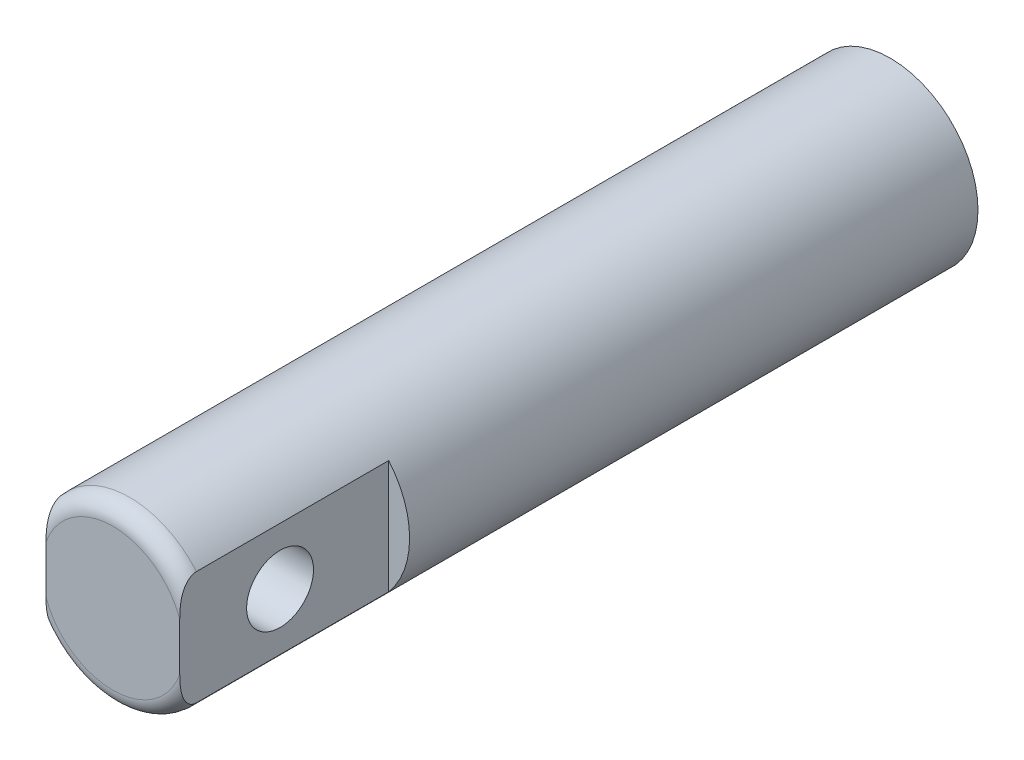
ISO-10303-21;
HEADER;
FILE_DESCRIPTION(('STEP AP214'),'2;1');
FILE_NAME('part.step','',(''),(''),'','','');
FILE_SCHEMA(('AUTOMOTIVE_DESIGN { 1 0 10303 214 1 1 1 1 }'));
ENDSEC;
DATA;
#1=APPLICATION_CONTEXT('core data for automotive mechanical design processes');
#2=APPLICATION_PROTOCOL_DEFINITION('international standard','automotive_design',2000,#1);
#3=PRODUCT_CONTEXT('',#1,'mechanical');
#4=PRODUCT('Part','Part','',(#3));
#5=PRODUCT_RELATED_PRODUCT_CATEGORY('part','',(#4));
#6=PRODUCT_DEFINITION_FORMATION('','',#4);
#7=PRODUCT_DEFINITION_CONTEXT('part definition',#1,'design');
#8=PRODUCT_DEFINITION('design','',#6,#7);
#9=PRODUCT_DEFINITION_SHAPE('','',#8);
#10=(LENGTH_UNIT() NAMED_UNIT(*) SI_UNIT(.MILLI.,.METRE.));
#11=(NAMED_UNIT(*) PLANE_ANGLE_UNIT() SI_UNIT($,.RADIAN.));
#12=(NAMED_UNIT(*) SI_UNIT($,.STERADIAN.) SOLID_ANGLE_UNIT());
#13=UNCERTAINTY_MEASURE_WITH_UNIT(LENGTH_MEASURE(1.E-05),#10,'distance_accuracy_value','');
#14=(GEOMETRIC_REPRESENTATION_CONTEXT(3) GLOBAL_UNCERTAINTY_ASSIGNED_CONTEXT((#13)) GLOBAL_UNIT_ASSIGNED_CONTEXT((#10,
#11,#12)) REPRESENTATION_CONTEXT('',''));
#15=CARTESIAN_POINT('',(0.,0.,0.));
#16=DIRECTION('',(0.,0.,1.));
#17=DIRECTION('',(1.,0.,0.));
#18=AXIS2_PLACEMENT_3D('',#15,#16,#17);
#19=CARTESIAN_POINT('',(0.,0.,91.));
#20=DIRECTION('',(0.,0.,1.));
#21=DIRECTION('',(1.,0.,0.));
#22=AXIS2_PLACEMENT_3D('',#19,#20,#21);
#23=TOROIDAL_SURFACE('',#22,8.5,2.);
#24=CARTESIAN_POINT('',(8.,0.,92.9364916731037));
#25=CARTESIAN_POINT('',(8.,-0.166652818421343,92.9364939579207));
#26=CARTESIAN_POINT('',(8.,-0.333306471950102,92.9378607946831));
#27=CARTESIAN_POINT('',(8.,-0.666576016376125,92.943047633006));
#28=CARTESIAN_POINT('',(8.,-0.83319190636539,92.9468676883482));
#29=CARTESIAN_POINT('',(8.,-1.16656356316754,92.9561406096452));
#30=CARTESIAN_POINT('',(8.,-1.33331927478195,92.9615953192753));
#31=CARTESIAN_POINT('',(8.,-1.66681535395985,92.9728596688331));
#32=CARTESIAN_POINT('',(8.,-1.83355572170017,92.9786693039658));
#33=CARTESIAN_POINT('',(8.,-2.16716592893274,92.9890180256884));
#34=CARTESIAN_POINT('',(8.,-2.33403579091536,92.9935564574999));
#35=CARTESIAN_POINT('',(8.,-2.66786727343868,92.9994531350503));
#36=CARTESIAN_POINT('',(8.,-2.83482890316947,93.000810961891));
#37=CARTESIAN_POINT('',(8.,-3.16843543275458,92.9981953625688));
#38=CARTESIAN_POINT('',(8.,-3.33508036916453,92.9942313874992));
#39=CARTESIAN_POINT('',(8.,-3.66799008079425,92.9785923259581));
#40=CARTESIAN_POINT('',(8.,-3.83425498322372,92.9669203813637));
#41=CARTESIAN_POINT('',(8.,-4.1220396325134,92.9375958863711));
#42=CARTESIAN_POINT('',(8.,-4.243797408137,92.9223319463412));
#43=CARTESIAN_POINT('',(8.,-4.4863399840906,92.8849012995347));
#44=CARTESIAN_POINT('',(8.,-4.60712424620168,92.8627310115278));
#45=CARTESIAN_POINT('',(8.,-4.84653285536041,92.8101947249113));
#46=CARTESIAN_POINT('',(8.,-4.96516284625497,92.7798549933071));
#47=CARTESIAN_POINT('',(8.,-5.19944488853411,92.7094381360583));
#48=CARTESIAN_POINT('',(8.,-5.31509930272157,92.6693690177954));
#49=CARTESIAN_POINT('',(8.,-5.54937366712782,92.5747472619722));
#50=CARTESIAN_POINT('',(8.,-5.66768413711802,92.5194121972475));
#51=CARTESIAN_POINT('',(8.,-5.89609109785004,92.3934902179627));
#52=CARTESIAN_POINT('',(8.,-6.00618974334215,92.3229073234477));
#53=CARTESIAN_POINT('',(8.,-6.1937517691522,92.1795426947507));
#54=CARTESIAN_POINT('',(8.,-6.27344658253986,92.1097099951505));
#55=CARTESIAN_POINT('',(8.,-6.42066030940009,91.958170058672));
#56=CARTESIAN_POINT('',(8.,-6.48819985080619,91.8764833723412));
#57=CARTESIAN_POINT('',(8.,-6.59317815260454,91.7216495335548));
#58=CARTESIAN_POINT('',(8.,-6.63396929165788,91.6507854014687));
#59=CARTESIAN_POINT('',(8.,-6.70337336810223,91.5032815656494));
#60=CARTESIAN_POINT('',(8.,-6.73199358916844,91.4266453486339));
#61=CARTESIAN_POINT('',(8.,-6.77519479669283,91.268929581456));
#62=CARTESIAN_POINT('',(8.,-6.78968550440503,91.1878249121787));
#63=CARTESIAN_POINT('',(8.,-6.80309008290311,91.0243372575922));
#64=CARTESIAN_POINT('',(8.,-6.80200974981785,90.9419547593454));
#65=CARTESIAN_POINT('',(8.,-6.78528906658382,90.7871402242298));
#66=CARTESIAN_POINT('',(8.,-6.77112712131398,90.7145421398895));
#67=CARTESIAN_POINT('',(8.,-6.73127254963743,90.5726126882836));
#68=CARTESIAN_POINT('',(8.,-6.70557870727617,90.503281666358));
#69=CARTESIAN_POINT('',(8.,-6.64288048980921,90.366544280118));
#70=CARTESIAN_POINT('',(8.,-6.60545742257812,90.2993318475849));
#71=CARTESIAN_POINT('',(8.,-6.52160469301462,90.1708264836324));
#72=CARTESIAN_POINT('',(8.,-6.4751703207901,90.109536672962));
#73=CARTESIAN_POINT('',(8.,-6.34645330475632,89.9599438615234));
#74=CARTESIAN_POINT('',(8.,-6.2588475341889,89.8762161417515));
#75=CARTESIAN_POINT('',(8.,-6.07145706827845,89.7236653836249));
#76=CARTESIAN_POINT('',(8.,-5.97164080880797,89.6548823064449));
#77=CARTESIAN_POINT('',(8.,-5.786283722387,89.5441569549453));
#78=CARTESIAN_POINT('',(8.,-5.70225743883031,89.4996205835938));
#79=CARTESIAN_POINT('',(8.,-5.53059976430005,89.4180401802916));
#80=CARTESIAN_POINT('',(8.,-5.4429659304811,89.3810013291406));
#81=CARTESIAN_POINT('',(8.,-5.26514523482237,89.3135982721339));
#82=CARTESIAN_POINT('',(8.,-5.17495703954609,89.283237627749));
#83=CARTESIAN_POINT('',(8.,-4.99287493894819,89.2284389675722));
#84=CARTESIAN_POINT('',(8.,-4.90098196431664,89.2039978169668));
#85=CARTESIAN_POINT('',(8.,-4.64862562897336,89.1443562113028));
#86=CARTESIAN_POINT('',(8.,-4.48695115158505,89.1142788061443));
#87=CARTESIAN_POINT('',(8.,-4.16177444577771,89.0661865715497));
#88=CARTESIAN_POINT('',(8.,-3.99827060856058,89.0481833751235));
#89=CARTESIAN_POINT('',(8.,-3.66993404632812,89.0213609014477));
#90=CARTESIAN_POINT('',(8.,-3.50509863634038,89.0125764014642));
#91=CARTESIAN_POINT('',(8.,-3.17529269467635,89.0017820258142));
#92=CARTESIAN_POINT('',(8.,-3.01032222103761,88.9997700420483));
#93=CARTESIAN_POINT('',(8.,-2.67896463386996,89.0002731693723));
#94=CARTESIAN_POINT('',(8.,-2.51257774350886,89.0028280099842));
#95=CARTESIAN_POINT('',(8.,-2.17986156495093,89.0104866902903));
#96=CARTESIAN_POINT('',(8.,-2.013532281369,89.0155907010312));
#97=CARTESIAN_POINT('',(8.,-1.68126037189634,89.0265262296342));
#98=CARTESIAN_POINT('',(8.,-1.51531768834333,89.0323561489043));
#99=CARTESIAN_POINT('',(8.,-1.18341143173154,89.0432423682235));
#100=CARTESIAN_POINT('',(8.,-1.01744785977915,89.0482986993277));
#101=CARTESIAN_POINT('',(8.,-0.689673247419912,89.0563992400415));
#102=CARTESIAN_POINT('',(8.,-0.527863471611761,89.0594911578541));
#103=CARTESIAN_POINT('',(8.,-0.204214680365553,89.0632419652386));
#104=CARTESIAN_POINT('',(8.,-0.0423756650937517,89.0639008682346));
#105=CARTESIAN_POINT('',(8.,0.281409616052571,89.0626552263483));
#106=CARTESIAN_POINT('',(8.,0.443355874261326,89.0607488154838));
#107=CARTESIAN_POINT('',(8.,0.767208327236938,89.0547474031421));
#108=CARTESIAN_POINT('',(8.,0.929114521107799,89.0506523564888));
#109=CARTESIAN_POINT('',(8.,1.25276106593956,89.0411207766026));
#110=CARTESIAN_POINT('',(8.,1.41450144931455,89.0356852670988));
#111=CARTESIAN_POINT('',(8.,1.73797552928937,89.0246961352492));
#112=CARTESIAN_POINT('',(8.,1.89970922595105,89.0191425145545));
#113=CARTESIAN_POINT('',(8.,2.22314660996105,89.0094425832785));
#114=CARTESIAN_POINT('',(8.,2.3848502750459,89.005295605175));
#115=CARTESIAN_POINT('',(8.,2.70830460053861,89.0001642861855));
#116=CARTESIAN_POINT('',(8.,2.87005525510179,88.9991796481176));
#117=CARTESIAN_POINT('',(8.,3.19522008044134,89.0023617326651));
#118=CARTESIAN_POINT('',(8.,3.35863395623558,89.0065824401218));
#119=CARTESIAN_POINT('',(8.,3.68507566780843,89.0225417631965));
#120=CARTESIAN_POINT('',(8.,3.84810361795371,89.0342777671838));
#121=CARTESIAN_POINT('',(8.,4.17248306946728,89.0677705672906));
#122=CARTESIAN_POINT('',(8.,4.33383874738514,89.0894846897739));
#123=CARTESIAN_POINT('',(8.,4.65422063155807,89.145826258785));
#124=CARTESIAN_POINT('',(8.,4.8132489894082,89.180440876871));
#125=CARTESIAN_POINT('',(8.,5.10846150745666,89.2609458503796));
#126=CARTESIAN_POINT('',(8.,5.2451283443978,89.3050255132726));
#127=CARTESIAN_POINT('',(8.,5.51294437063561,89.4087147117654));
#128=CARTESIAN_POINT('',(8.,5.64408113197755,89.4683572651194));
#129=CARTESIAN_POINT('',(8.,5.89825838271358,89.6069810267009));
#130=CARTESIAN_POINT('',(8.,6.02116522337418,89.6862131211455));
#131=CARTESIAN_POINT('',(8.,6.24992958930996,89.8662935856445));
#132=CARTESIAN_POINT('',(8.,6.35585874436346,89.9670467173732));
#133=CARTESIAN_POINT('',(8.,6.50227081110312,90.1441226404615));
#134=CARTESIAN_POINT('',(8.,6.55162701711757,90.2131185564109));
#135=CARTESIAN_POINT('',(8.,6.63879015343456,90.3581304363642));
#136=CARTESIAN_POINT('',(8.,6.6766030715192,90.4341427340592));
#137=CARTESIAN_POINT('',(8.,6.73844075877818,90.5923871013904));
#138=CARTESIAN_POINT('',(8.,6.76235003864857,90.6746650220252));
#139=CARTESIAN_POINT('',(8.,6.79387966720989,90.8422902151931));
#140=CARTESIAN_POINT('',(8.,6.80151222001105,90.9276351392618));
#141=CARTESIAN_POINT('',(8.,6.79992828951668,91.0881846310923));
#142=CARTESIAN_POINT('',(8.,6.79256889109733,91.163413672167));
#143=CARTESIAN_POINT('',(8.,6.76517658199527,91.3115069590892));
#144=CARTESIAN_POINT('',(8.,6.74514316524085,91.3843711103848));
#145=CARTESIAN_POINT('',(8.,6.69392806613157,91.525330250092));
#146=CARTESIAN_POINT('',(8.,6.66283995524149,91.5934596976935));
#147=CARTESIAN_POINT('',(8.,6.59117220353074,91.7244848557351));
#148=CARTESIAN_POINT('',(8.,6.55058859949792,91.7873783659071));
#149=CARTESIAN_POINT('',(8.,6.43981970526149,91.9367866354746));
#150=CARTESIAN_POINT('',(8.,6.36487325732886,92.019776775454));
#151=CARTESIAN_POINT('',(8.,6.20267677844999,92.1727061692086));
#152=CARTESIAN_POINT('',(8.,6.11539784189344,92.2426138381992));
#153=CARTESIAN_POINT('',(8.,5.88521007607402,92.4031220244544));
#154=CARTESIAN_POINT('',(8.,5.73681904136397,92.485810213404));
#155=CARTESIAN_POINT('',(8.,5.4294626378962,92.6277108691291));
#156=CARTESIAN_POINT('',(8.,5.27048100148958,92.6868862007324));
#157=CARTESIAN_POINT('',(8.,4.92288981058845,92.7937459230261));
#158=CARTESIAN_POINT('',(8.,4.73338108219594,92.8384277875612));
#159=CARTESIAN_POINT('',(8.,4.35078401065378,92.9089561179181));
#160=CARTESIAN_POINT('',(8.,4.15768999939604,92.9347695881168));
#161=CARTESIAN_POINT('',(8.,3.76918616366958,92.9725734832073));
#162=CARTESIAN_POINT('',(8.,3.57376944712806,92.9844873750666));
#163=CARTESIAN_POINT('',(8.,3.18277931218556,92.9985392713327));
#164=CARTESIAN_POINT('',(8.,2.98720607350566,93.0006835127629));
#165=CARTESIAN_POINT('',(8.,2.55849199681393,92.9987882548839));
#166=CARTESIAN_POINT('',(8.,2.32536429493664,92.9934793575633));
#167=CARTESIAN_POINT('',(8.,1.85916373721993,92.9797675428669));
#168=CARTESIAN_POINT('',(8.,1.62609091373583,92.9713637810908));
#169=CARTESIAN_POINT('',(8.,1.16084571629133,92.95594770535));
#170=CARTESIAN_POINT('',(8.,0.928673573531792,92.9489298210647));
#171=CARTESIAN_POINT('',(8.,0.580394868913362,92.9416159070027));
#172=CARTESIAN_POINT('',(8.,0.464324005467315,92.939713486248));
#173=CARTESIAN_POINT('',(8.,0.232168896377244,92.9371505759631));
#174=CARTESIAN_POINT('',(8.,0.116084650787305,92.9364900815784));
#175=CARTESIAN_POINT('',(8.,0.,92.9364916731037));
#176=B_SPLINE_CURVE_WITH_KNOTS('',3,(#24,#25,#26,#27,#28,#29,#30,#31,#32,#33,#34,#35,#36,#37,
#38,#39,#40,#41,#42,#43,#44,#45,#46,#47,#48,#49,#50,#51,#52,#53,#54,#55,#56,#57,#58,#59,#60,#61,
#62,#63,#64,#65,#66,#67,#68,#69,#70,#71,#72,#73,#74,#75,#76,#77,#78,#79,#80,#81,#82,#83,#84,#85,
#86,#87,#88,#89,#90,#91,#92,#93,#94,#95,#96,#97,#98,#99,#100,#101,#102,#103,#104,#105,#106,#107,
#108,#109,#110,#111,#112,#113,#114,#115,#116,#117,#118,#119,#120,#121,#122,#123,#124,#125,#126,
#127,#128,#129,#130,#131,#132,#133,#134,#135,#136,#137,#138,#139,#140,#141,#142,#143,#144,#145,
#146,#147,#148,#149,#150,#151,#152,#153,#154,#155,#156,#157,#158,#159,#160,#161,#162,#163,#164,
#165,#166,#167,#168,#169,#170,#171,#172,#173,#174,#175),.UNSPECIFIED.,.T.,.F.,(4,2,2,2,2,2,2,2,
2,2,2,2,2,2,2,2,2,2,2,2,2,2,2,2,2,2,2,2,2,2,2,2,2,2,2,2,2,2,2,2,2,2,2,2,2,2,2,2,2,2,2,2,2,2,2,2,
2,2,2,2,2,2,2,2,2,2,2,2,2,2,2,2,2,2,2,4),(0.,0.499955120718243,0.999921202299113,
1.50045331593187,2.00097866892249,2.50176136316987,3.00261000874285,3.50257036285664,
4.0023270517626,4.3703026557744,4.7384693890527,5.10546621545626,5.47216201753186,
5.86310187840034,6.25393879465313,6.57074310393241,6.88700460843134,7.13133907592683,
7.37552711519611,7.62126533427478,7.86691208268013,8.08780132437345,8.30871386270207,
8.53863947404575,8.76868558465918,9.13017800945901,9.49262546364005,9.77753082112908,
10.0626323816875,10.3478856195303,10.6329874625672,11.1256710600752,11.6188286589285,
12.1138400651089,12.6086973735049,13.1078807134155,13.6070975525473,14.105233843465,
14.6033501318066,15.0888532894878,15.5743537683983,16.0602075861855,16.5460714329846,
17.0315653621466,17.5170525090348,18.0023089446186,18.4875197767111,18.9778053397399,
19.4679206166686,19.9559590401287,20.4435134403546,20.8735820235775,21.3045705525205,
21.7413940629551,22.1763231047479,22.4299271279953,22.683399376302,22.9389480552998,
23.1943050592538,23.4199508716584,23.6456056946364,23.8693942507042,24.0932763783926,
24.4268507344066,24.7612203267502,25.2679718258248,25.7755205146801,26.3582859383845,
26.9420680359729,27.5290495721366,28.1156563220122,28.8151489150077,29.5148324985784,
30.2116438602019,30.5598968511748,30.9081484808062),.UNSPECIFIED.);
#177=CARTESIAN_POINT('',(8.,-2.87228132326346,92.9999999999947));
#178=VERTEX_POINT('',#177);
#179=CARTESIAN_POINT('',(8.,-6.80073525437462,90.9999999999925));
#180=VERTEX_POINT('',#179);
#181=EDGE_CURVE('E40',#178,#180,#176,.T.);
#182=ORIENTED_EDGE('',*,*,#181,.F.);
#183=CARTESIAN_POINT('',(0.,0.,93.));
#184=DIRECTION('',(0.,0.,1.));
#185=DIRECTION('',(1.,0.,0.));
#186=AXIS2_PLACEMENT_3D('',#183,#184,#185);
#187=CIRCLE('',#186,8.5);
#188=CARTESIAN_POINT('',(-8.,-2.87228132326902,92.9999999999947));
#189=VERTEX_POINT('',#188);
#190=EDGE_CURVE('E126',#189,#178,#187,.T.);
#191=ORIENTED_EDGE('',*,*,#190,.F.);
#192=CARTESIAN_POINT('',(-8.,0.,92.9364916731037));
#193=CARTESIAN_POINT('',(-8.,0.166652818421343,92.9364939579207));
#194=CARTESIAN_POINT('',(-8.,0.333306471950102,92.9378607946831));
#195=CARTESIAN_POINT('',(-8.,0.666576016376125,92.943047633006));
#196=CARTESIAN_POINT('',(-8.,0.83319190636539,92.9468676883482));
#197=CARTESIAN_POINT('',(-8.,1.16656356316754,92.9561406096452));
#198=CARTESIAN_POINT('',(-8.,1.33331927478195,92.9615953192753));
#199=CARTESIAN_POINT('',(-8.,1.66681535395985,92.9728596688331));
#200=CARTESIAN_POINT('',(-8.,1.83355572170017,92.9786693039658));
#201=CARTESIAN_POINT('',(-8.,2.16716592893274,92.9890180256884));
#202=CARTESIAN_POINT('',(-8.,2.33403579091536,92.9935564574999));
#203=CARTESIAN_POINT('',(-8.,2.66786727343868,92.9994531350503));
#204=CARTESIAN_POINT('',(-8.,2.83482890316947,93.000810961891));
#205=CARTESIAN_POINT('',(-8.,3.16843543275458,92.9981953625688));
#206=CARTESIAN_POINT('',(-8.,3.33508036916453,92.9942313874992));
#207=CARTESIAN_POINT('',(-8.,3.66799008079425,92.9785923259581));
#208=CARTESIAN_POINT('',(-8.,3.83425498322372,92.9669203813637));
#209=CARTESIAN_POINT('',(-8.,4.1220396325134,92.9375958863711));
#210=CARTESIAN_POINT('',(-8.,4.243797408137,92.9223319463412));
#211=CARTESIAN_POINT('',(-8.,4.4863399840906,92.8849012995347));
#212=CARTESIAN_POINT('',(-8.,4.60712424620168,92.8627310115278));
#213=CARTESIAN_POINT('',(-8.,4.84653285536041,92.8101947249113));
#214=CARTESIAN_POINT('',(-8.,4.96516284625497,92.7798549933071));
#215=CARTESIAN_POINT('',(-8.,5.19944488853411,92.7094381360583));
#216=CARTESIAN_POINT('',(-8.,5.31509930272157,92.6693690177954));
#217=CARTESIAN_POINT('',(-8.,5.54937366712782,92.5747472619722));
#218=CARTESIAN_POINT('',(-8.,5.66768413711802,92.5194121972475));
#219=CARTESIAN_POINT('',(-8.,5.89609109785004,92.3934902179627));
#220=CARTESIAN_POINT('',(-8.,6.00618974334215,92.3229073234477));
#221=CARTESIAN_POINT('',(-8.,6.1937517691522,92.1795426947507));
#222=CARTESIAN_POINT('',(-8.,6.27344658253986,92.1097099951505));
#223=CARTESIAN_POINT('',(-8.,6.42066030940009,91.958170058672));
#224=CARTESIAN_POINT('',(-8.,6.48819985080619,91.8764833723412));
#225=CARTESIAN_POINT('',(-8.,6.59317815260454,91.7216495335548));
#226=CARTESIAN_POINT('',(-8.,6.63396929165788,91.6507854014687));
#227=CARTESIAN_POINT('',(-8.,6.70337336810223,91.5032815656494));
#228=CARTESIAN_POINT('',(-8.,6.73199358916844,91.4266453486339));
#229=CARTESIAN_POINT('',(-8.,6.77519479669283,91.268929581456));
#230=CARTESIAN_POINT('',(-8.,6.78968550440503,91.1878249121787));
#231=CARTESIAN_POINT('',(-8.,6.80309008290311,91.0243372575922));
#232=CARTESIAN_POINT('',(-8.,6.80200974981785,90.9419547593454));
#233=CARTESIAN_POINT('',(-8.,6.78528906658382,90.7871402242298));
#234=CARTESIAN_POINT('',(-8.,6.77112712131398,90.7145421398895));
#235=CARTESIAN_POINT('',(-8.,6.73127254963743,90.5726126882836));
#236=CARTESIAN_POINT('',(-8.,6.70557870727617,90.503281666358));
#237=CARTESIAN_POINT('',(-8.,6.64288048980921,90.366544280118));
#238=CARTESIAN_POINT('',(-8.,6.60545742257812,90.2993318475849));
#239=CARTESIAN_POINT('',(-8.,6.52160469301462,90.1708264836324));
#240=CARTESIAN_POINT('',(-8.,6.4751703207901,90.109536672962));
#241=CARTESIAN_POINT('',(-8.,6.34645330475632,89.9599438615234));
#242=CARTESIAN_POINT('',(-8.,6.2588475341889,89.8762161417515));
#243=CARTESIAN_POINT('',(-8.,6.07145706827845,89.7236653836249));
#244=CARTESIAN_POINT('',(-8.,5.97164080880797,89.6548823064449));
#245=CARTESIAN_POINT('',(-8.,5.786283722387,89.5441569549453));
#246=CARTESIAN_POINT('',(-8.,5.70225743883031,89.4996205835938));
#247=CARTESIAN_POINT('',(-8.,5.53059976430005,89.4180401802916));
#248=CARTESIAN_POINT('',(-8.,5.4429659304811,89.3810013291406));
#249=CARTESIAN_POINT('',(-8.,5.26514523482237,89.3135982721339));
#250=CARTESIAN_POINT('',(-8.,5.17495703954609,89.283237627749));
#251=CARTESIAN_POINT('',(-8.,4.99287493894819,89.2284389675722));
#252=CARTESIAN_POINT('',(-8.,4.90098196431664,89.2039978169668));
#253=CARTESIAN_POINT('',(-8.,4.64862562897336,89.1443562113028));
#254=CARTESIAN_POINT('',(-8.,4.48695115158505,89.1142788061443));
#255=CARTESIAN_POINT('',(-8.,4.16177444577771,89.0661865715497));
#256=CARTESIAN_POINT('',(-8.,3.99827060856058,89.0481833751235));
#257=CARTESIAN_POINT('',(-8.,3.66993404632812,89.0213609014477));
#258=CARTESIAN_POINT('',(-8.,3.50509863634038,89.0125764014642));
#259=CARTESIAN_POINT('',(-8.,3.17529269467635,89.0017820258142));
#260=CARTESIAN_POINT('',(-8.,3.01032222103761,88.9997700420483));
#261=CARTESIAN_POINT('',(-8.,2.67896463386996,89.0002731693723));
#262=CARTESIAN_POINT('',(-8.,2.51257774350886,89.0028280099842));
#263=CARTESIAN_POINT('',(-8.,2.17986156495093,89.0104866902903));
#264=CARTESIAN_POINT('',(-8.,2.013532281369,89.0155907010312));
#265=CARTESIAN_POINT('',(-8.,1.68126037189634,89.0265262296342));
#266=CARTESIAN_POINT('',(-8.,1.51531768834333,89.0323561489043));
#267=CARTESIAN_POINT('',(-8.,1.18341143173154,89.0432423682235));
#268=CARTESIAN_POINT('',(-8.,1.01744785977915,89.0482986993277));
#269=CARTESIAN_POINT('',(-8.,0.689673247419912,89.0563992400415));
#270=CARTESIAN_POINT('',(-8.,0.527863471611761,89.0594911578541));
#271=CARTESIAN_POINT('',(-8.,0.204214680365553,89.0632419652386));
#272=CARTESIAN_POINT('',(-8.,0.0423756650937517,89.0639008682346));
#273=CARTESIAN_POINT('',(-8.,-0.281409616052571,89.0626552263483));
#274=CARTESIAN_POINT('',(-8.,-0.443355874261326,89.0607488154838));
#275=CARTESIAN_POINT('',(-8.,-0.767208327236938,89.0547474031421));
#276=CARTESIAN_POINT('',(-8.,-0.929114521107799,89.0506523564888));
#277=CARTESIAN_POINT('',(-8.,-1.25276106593956,89.0411207766026));
#278=CARTESIAN_POINT('',(-8.,-1.41450144931455,89.0356852670988));
#279=CARTESIAN_POINT('',(-8.,-1.73797552928937,89.0246961352492));
#280=CARTESIAN_POINT('',(-8.,-1.89970922595105,89.0191425145545));
#281=CARTESIAN_POINT('',(-8.,-2.22314660996105,89.0094425832785));
#282=CARTESIAN_POINT('',(-8.,-2.3848502750459,89.005295605175));
#283=CARTESIAN_POINT('',(-8.,-2.70830460053861,89.0001642861855));
#284=CARTESIAN_POINT('',(-8.,-2.87005525510179,88.9991796481176));
#285=CARTESIAN_POINT('',(-8.,-3.19522008044134,89.0023617326651));
#286=CARTESIAN_POINT('',(-8.,-3.35863395623558,89.0065824401218));
#287=CARTESIAN_POINT('',(-8.,-3.68507566780843,89.0225417631965));
#288=CARTESIAN_POINT('',(-8.,-3.84810361795371,89.0342777671838));
#289=CARTESIAN_POINT('',(-8.,-4.17248306946728,89.0677705672906));
#290=CARTESIAN_POINT('',(-8.,-4.33383874738514,89.0894846897739));
#291=CARTESIAN_POINT('',(-8.,-4.65422063155807,89.145826258785));
#292=CARTESIAN_POINT('',(-8.,-4.8132489894082,89.180440876871));
#293=CARTESIAN_POINT('',(-8.,-5.10846150745666,89.2609458503796));
#294=CARTESIAN_POINT('',(-8.,-5.2451283443978,89.3050255132726));
#295=CARTESIAN_POINT('',(-8.,-5.51294437063561,89.4087147117654));
#296=CARTESIAN_POINT('',(-8.,-5.64408113197755,89.4683572651194));
#297=CARTESIAN_POINT('',(-8.,-5.89825838271358,89.6069810267009));
#298=CARTESIAN_POINT('',(-8.,-6.02116522337418,89.6862131211455));
#299=CARTESIAN_POINT('',(-8.,-6.24992958930996,89.8662935856445));
#300=CARTESIAN_POINT('',(-8.,-6.35585874436346,89.9670467173732));
#301=CARTESIAN_POINT('',(-8.,-6.50227081110312,90.1441226404615));
#302=CARTESIAN_POINT('',(-8.,-6.55162701711757,90.2131185564109));
#303=CARTESIAN_POINT('',(-8.,-6.63879015343456,90.3581304363642));
#304=CARTESIAN_POINT('',(-8.,-6.6766030715192,90.4341427340592));
#305=CARTESIAN_POINT('',(-8.,-6.73844075877818,90.5923871013904));
#306=CARTESIAN_POINT('',(-8.,-6.76235003864857,90.6746650220252));
#307=CARTESIAN_POINT('',(-8.,-6.79387966720989,90.8422902151931));
#308=CARTESIAN_POINT('',(-8.,-6.80151222001105,90.9276351392618));
#309=CARTESIAN_POINT('',(-8.,-6.79992828951668,91.0881846310923));
#310=CARTESIAN_POINT('',(-8.,-6.79256889109733,91.163413672167));
#311=CARTESIAN_POINT('',(-8.,-6.76517658199527,91.3115069590892));
#312=CARTESIAN_POINT('',(-8.,-6.74514316524085,91.3843711103848));
#313=CARTESIAN_POINT('',(-8.,-6.69392806613157,91.525330250092));
#314=CARTESIAN_POINT('',(-8.,-6.66283995524149,91.5934596976935));
#315=CARTESIAN_POINT('',(-8.,-6.59117220353074,91.7244848557351));
#316=CARTESIAN_POINT('',(-8.,-6.55058859949792,91.7873783659071));
#317=CARTESIAN_POINT('',(-8.,-6.43981970526149,91.9367866354746));
#318=CARTESIAN_POINT('',(-8.,-6.36487325732886,92.019776775454));
#319=CARTESIAN_POINT('',(-8.,-6.20267677844999,92.1727061692086));
#320=CARTESIAN_POINT('',(-8.,-6.11539784189344,92.2426138381992));
#321=CARTESIAN_POINT('',(-8.,-5.88521007607402,92.4031220244544));
#322=CARTESIAN_POINT('',(-8.,-5.73681904136397,92.485810213404));
#323=CARTESIAN_POINT('',(-8.,-5.4294626378962,92.6277108691291));
#324=CARTESIAN_POINT('',(-8.,-5.27048100148958,92.6868862007324));
#325=CARTESIAN_POINT('',(-8.,-4.92288981058845,92.7937459230261));
#326=CARTESIAN_POINT('',(-8.,-4.73338108219594,92.8384277875612));
#327=CARTESIAN_POINT('',(-8.,-4.35078401065378,92.9089561179181));
#328=CARTESIAN_POINT('',(-8.,-4.15768999939604,92.9347695881168));
#329=CARTESIAN_POINT('',(-8.,-3.76918616366958,92.9725734832073));
#330=CARTESIAN_POINT('',(-8.,-3.57376944712806,92.9844873750666));
#331=CARTESIAN_POINT('',(-8.,-3.18277931218556,92.9985392713327));
#332=CARTESIAN_POINT('',(-8.,-2.98720607350566,93.0006835127629));
#333=CARTESIAN_POINT('',(-8.,-2.55849199681393,92.9987882548839));
#334=CARTESIAN_POINT('',(-8.,-2.32536429493664,92.9934793575633));
#335=CARTESIAN_POINT('',(-8.,-1.85916373721993,92.9797675428669));
#336=CARTESIAN_POINT('',(-8.,-1.62609091373583,92.9713637810908));
#337=CARTESIAN_POINT('',(-8.,-1.16084571629133,92.95594770535));
#338=CARTESIAN_POINT('',(-8.,-0.928673573531792,92.9489298210647));
#339=CARTESIAN_POINT('',(-8.,-0.580394868913362,92.9416159070027));
#340=CARTESIAN_POINT('',(-8.,-0.464324005467315,92.939713486248));
#341=CARTESIAN_POINT('',(-8.,-0.232168896377244,92.9371505759631));
#342=CARTESIAN_POINT('',(-8.,-0.116084650787305,92.9364900815784));
#343=CARTESIAN_POINT('',(-8.,0.,92.9364916731037));
#344=B_SPLINE_CURVE_WITH_KNOTS('',3,(#192,#193,#194,#195,#196,#197,#198,#199,#200,#201,#202,
#203,#204,#205,#206,#207,#208,#209,#210,#211,#212,#213,#214,#215,#216,#217,#218,#219,#220,#221,
#222,#223,#224,#225,#226,#227,#228,#229,#230,#231,#232,#233,#234,#235,#236,#237,#238,#239,#240,
#241,#242,#243,#244,#245,#246,#247,#248,#249,#250,#251,#252,#253,#254,#255,#256,#257,#258,#259,
#260,#261,#262,#263,#264,#265,#266,#267,#268,#269,#270,#271,#272,#273,#274,#275,#276,#277,#278,
#279,#280,#281,#282,#283,#284,#285,#286,#287,#288,#289,#290,#291,#292,#293,#294,#295,#296,#297,
#298,#299,#300,#301,#302,#303,#304,#305,#306,#307,#308,#309,#310,#311,#312,#313,#314,#315,#316,
#317,#318,#319,#320,#321,#322,#323,#324,#325,#326,#327,#328,#329,#330,#331,#332,#333,#334,#335,
#336,#337,#338,#339,#340,#341,#342,#343),.UNSPECIFIED.,.T.,.F.,(4,2,2,2,2,2,2,2,2,2,2,2,2,2,2,2,
2,2,2,2,2,2,2,2,2,2,2,2,2,2,2,2,2,2,2,2,2,2,2,2,2,2,2,2,2,2,2,2,2,2,2,2,2,2,2,2,2,2,2,2,2,2,2,2,
2,2,2,2,2,2,2,2,2,2,2,4),(0.,0.499955120718243,0.999921202299113,1.50045331593187,
2.00097866892249,2.50176136316987,3.00261000874285,3.50257036285664,4.0023270517626,
4.3703026557744,4.7384693890527,5.10546621545626,5.47216201753186,5.86310187840034,
6.25393879465313,6.57074310393241,6.88700460843134,7.13133907592683,7.37552711519611,
7.62126533427478,7.86691208268013,8.08780132437345,8.30871386270207,8.53863947404575,
8.76868558465918,9.13017800945901,9.49262546364005,9.77753082112908,10.0626323816875,
10.3478856195303,10.6329874625672,11.1256710600752,11.6188286589285,12.1138400651089,
12.6086973735049,13.1078807134155,13.6070975525473,14.105233843465,14.6033501318066,
15.0888532894878,15.5743537683983,16.0602075861855,16.5460714329846,17.0315653621466,
17.5170525090348,18.0023089446186,18.4875197767111,18.9778053397399,19.4679206166686,
19.9559590401287,20.4435134403546,20.8735820235775,21.3045705525205,21.7413940629551,
22.1763231047479,22.4299271279953,22.683399376302,22.9389480552998,23.1943050592538,
23.4199508716584,23.6456056946364,23.8693942507042,24.0932763783926,24.4268507344066,
24.7612203267502,25.2679718258248,25.7755205146801,26.3582859383845,26.9420680359729,
27.5290495721366,28.1156563220122,28.8151489150077,29.5148324985784,30.2116438602019,
30.5598968511748,30.9081484808062),.UNSPECIFIED.);
#345=CARTESIAN_POINT('',(-8.,-6.80073525436772,91.));
#346=VERTEX_POINT('',#345);
#347=EDGE_CURVE('E130',#346,#189,#344,.T.);
#348=ORIENTED_EDGE('',*,*,#347,.F.);
#349=CARTESIAN_POINT('',(0.,0.,91.));
#350=DIRECTION('',(0.,0.,1.));
#351=DIRECTION('',(1.,0.,0.));
#352=AXIS2_PLACEMENT_3D('',#349,#350,#351);
#353=CIRCLE('',#352,10.5);
#354=EDGE_CURVE('E55',#180,#346,#353,.F.);
#355=ORIENTED_EDGE('',*,*,#354,.F.);
#356=EDGE_LOOP('',(#182,#191,#348,#355));
#357=FACE_BOUND('',#356,.T.);
#358=ADVANCED_FACE('F30',(#357),#23,.T.);
#359=CARTESIAN_POINT('',(0.,0.,93.));
#360=DIRECTION('',(0.,0.,-1.));
#361=DIRECTION('',(-1.,0.,0.));
#362=AXIS2_PLACEMENT_3D('',#359,#360,#361);
#363=CYLINDRICAL_SURFACE('',#362,10.5);
#364=CARTESIAN_POINT('',(-8.,6.80073525437462,90.9999999999925));
#365=VERTEX_POINT('',#364);
#366=CARTESIAN_POINT('',(8.,6.80073525436772,91.));
#367=VERTEX_POINT('',#366);
#368=EDGE_CURVE('E102',#365,#367,#353,.F.);
#369=ORIENTED_EDGE('',*,*,#368,.T.);
#370=DIRECTION('',(0.,0.,-1.));
#371=VECTOR('',#370,1.);
#372=CARTESIAN_POINT('',(8.,6.80073525436772,93.));
#373=LINE('',#372,#371);
#374=CARTESIAN_POINT('',(8.,6.80073525436772,67.9999999999946));
#375=VERTEX_POINT('',#374);
#376=EDGE_CURVE('E47',#367,#375,#373,.T.);
#377=ORIENTED_EDGE('',*,*,#376,.T.);
#378=CARTESIAN_POINT('',(0.,0.,67.9999999999946));
#379=DIRECTION('',(0.,0.,-1.));
#380=DIRECTION('',(-1.,0.,0.));
#381=AXIS2_PLACEMENT_3D('',#378,#379,#380);
#382=CIRCLE('',#381,10.5);
#383=CARTESIAN_POINT('',(8.,-6.80073525436772,67.9999999999946));
#384=VERTEX_POINT('',#383);
#385=EDGE_CURVE('E11',#375,#384,#382,.T.);
#386=ORIENTED_EDGE('',*,*,#385,.T.);
#387=DIRECTION('',(0.,0.,-1.));
#388=VECTOR('',#387,1.);
#389=CARTESIAN_POINT('',(8.,-6.80073525436772,93.));
#390=LINE('',#389,#388);
#391=EDGE_CURVE('E85',#384,#180,#390,.F.);
#392=ORIENTED_EDGE('',*,*,#391,.T.);
#393=ORIENTED_EDGE('',*,*,#354,.T.);
#394=DIRECTION('',(0.,0.,-1.));
#395=VECTOR('',#394,1.);
#396=CARTESIAN_POINT('',(-8.,-6.80073525436772,93.));
#397=LINE('',#396,#395);
#398=CARTESIAN_POINT('',(-8.,-6.80073525436772,67.9999999999946));
#399=VERTEX_POINT('',#398);
#400=EDGE_CURVE('E110',#346,#399,#397,.T.);
#401=ORIENTED_EDGE('',*,*,#400,.T.);
#402=CARTESIAN_POINT('',(0.,0.,67.9999999999946));
#403=DIRECTION('',(0.,0.,-1.));
#404=DIRECTION('',(-1.,0.,0.));
#405=AXIS2_PLACEMENT_3D('',#402,#403,#404);
#406=CIRCLE('',#405,10.5);
#407=CARTESIAN_POINT('',(-8.,6.80073525436772,67.9999999999946));
#408=VERTEX_POINT('',#407);
#409=EDGE_CURVE('E136',#399,#408,#406,.T.);
#410=ORIENTED_EDGE('',*,*,#409,.T.);
#411=DIRECTION('',(0.,0.,-1.));
#412=VECTOR('',#411,1.);
#413=CARTESIAN_POINT('',(-8.,6.80073525436772,93.));
#414=LINE('',#413,#412);
#415=EDGE_CURVE('E114',#408,#365,#414,.F.);
#416=ORIENTED_EDGE('',*,*,#415,.T.);
#417=EDGE_LOOP('',(#369,#377,#386,#392,#393,#401,#410,#416));
#418=FACE_BOUND('',#417,.T.);
#419=CARTESIAN_POINT('',(0.,0.,0.));
#420=DIRECTION('',(0.,0.,1.));
#421=DIRECTION('',(1.,0.,0.));
#422=AXIS2_PLACEMENT_3D('',#419,#420,#421);
#423=CIRCLE('',#422,10.5);
#424=CARTESIAN_POINT('',(10.5,0.,0.));
#425=VERTEX_POINT('',#424);
#426=EDGE_CURVE('E120',#425,#425,#423,.T.);
#427=ORIENTED_EDGE('',*,*,#426,.T.);
#428=EDGE_LOOP('',(#427));
#429=FACE_BOUND('',#428,.T.);
#430=ADVANCED_FACE('F98',(#418,#429),#363,.T.);
#431=CARTESIAN_POINT('',(0.,0.,93.));
#432=DIRECTION('',(0.,0.,1.));
#433=DIRECTION('',(1.,0.,0.));
#434=AXIS2_PLACEMENT_3D('',#431,#432,#433);
#435=PLANE('',#434);
#436=DIRECTION('',(0.,1.,0.));
#437=VECTOR('',#436,1.);
#438=CARTESIAN_POINT('',(8.,-15.,92.9999999999947));
#439=LINE('',#438,#437);
#440=CARTESIAN_POINT('',(8.,2.87228132326902,92.9999999999947));
#441=VERTEX_POINT('',#440);
#442=EDGE_CURVE('E94',#178,#441,#439,.T.);
#443=ORIENTED_EDGE('',*,*,#442,.T.);
#444=CARTESIAN_POINT('',(-8.,2.87228132326346,92.9999999999947));
#445=VERTEX_POINT('',#444);
#446=EDGE_CURVE('E125',#441,#445,#187,.T.);
#447=ORIENTED_EDGE('',*,*,#446,.T.);
#448=DIRECTION('',(0.,1.,0.));
#449=VECTOR('',#448,1.);
#450=CARTESIAN_POINT('',(-8.,-15.,92.9999999999947));
#451=LINE('',#450,#449);
#452=EDGE_CURVE('E90',#189,#445,#451,.T.);
#453=ORIENTED_EDGE('',*,*,#452,.F.);
#454=ORIENTED_EDGE('',*,*,#190,.T.);
#455=EDGE_LOOP('',(#443,#447,#453,#454));
#456=FACE_BOUND('',#455,.T.);
#457=ADVANCED_FACE('F155',(#456),#435,.T.);
#458=CARTESIAN_POINT('',(0.,0.,0.));
#459=DIRECTION('',(0.,0.,1.));
#460=DIRECTION('',(1.,0.,0.));
#461=AXIS2_PLACEMENT_3D('',#458,#459,#460);
#462=PLANE('',#461);
#463=CARTESIAN_POINT('',(0.,0.,0.));
#464=DIRECTION('',(0.,0.,-1.));
#465=DIRECTION('',(-1.,0.,0.));
#466=AXIS2_PLACEMENT_3D('',#463,#464,#465);
#467=CIRCLE('',#466,5.25);
#468=CARTESIAN_POINT('',(-5.25,0.,0.));
#469=VERTEX_POINT('',#468);
#470=EDGE_CURVE('E116',#469,#469,#467,.T.);
#471=ORIENTED_EDGE('',*,*,#470,.F.);
#472=EDGE_LOOP('',(#471));
#473=FACE_BOUND('',#472,.T.);
#474=ORIENTED_EDGE('',*,*,#426,.F.);
#475=EDGE_LOOP('',(#474));
#476=FACE_BOUND('',#475,.T.);
#477=ADVANCED_FACE('F153',(#473,#476),#462,.F.);
#478=CARTESIAN_POINT('',(0.,0.,70.));
#479=DIRECTION('',(0.,0.,-1.));
#480=DIRECTION('',(-1.,0.,0.));
#481=AXIS2_PLACEMENT_3D('',#478,#479,#480);
#482=CYLINDRICAL_SURFACE('',#481,5.25);
#483=CARTESIAN_POINT('',(0.,0.,70.));
#484=DIRECTION('',(0.,0.,-1.));
#485=DIRECTION('',(-1.,0.,0.));
#486=AXIS2_PLACEMENT_3D('',#483,#484,#485);
#487=CIRCLE('',#486,5.25);
#488=CARTESIAN_POINT('',(-5.25,0.,70.));
#489=VERTEX_POINT('',#488);
#490=EDGE_CURVE('E117',#489,#489,#487,.T.);
#491=ORIENTED_EDGE('',*,*,#490,.F.);
#492=EDGE_LOOP('',(#491));
#493=FACE_BOUND('',#492,.T.);
#494=ORIENTED_EDGE('',*,*,#470,.T.);
#495=EDGE_LOOP('',(#494));
#496=FACE_BOUND('',#495,.T.);
#497=ADVANCED_FACE('F149',(#493,#496),#482,.F.);
#498=CARTESIAN_POINT('',(0.,0.,70.));
#499=DIRECTION('',(0.,0.,-1.));
#500=DIRECTION('',(-1.,0.,0.));
#501=AXIS2_PLACEMENT_3D('',#498,#499,#500);
#502=PLANE('',#501);
#503=ORIENTED_EDGE('',*,*,#490,.T.);
#504=EDGE_LOOP('',(#503));
#505=FACE_BOUND('',#504,.T.);
#506=ADVANCED_FACE('F146',(#505),#502,.T.);
#507=EDGE_CURVE('E176',#367,#441,#176,.T.);
#508=ORIENTED_EDGE('',*,*,#507,.F.);
#509=ORIENTED_EDGE('',*,*,#368,.F.);
#510=EDGE_CURVE('E135',#445,#365,#344,.T.);
#511=ORIENTED_EDGE('',*,*,#510,.F.);
#512=ORIENTED_EDGE('',*,*,#446,.F.);
#513=EDGE_LOOP('',(#508,#509,#511,#512));
#514=FACE_BOUND('',#513,.T.);
#515=ADVANCED_FACE('F32',(#514),#23,.T.);
#516=CARTESIAN_POINT('',(-8.,-15.,67.9999999999946));
#517=DIRECTION('',(0.,0.,-1.));
#518=DIRECTION('',(-1.,0.,0.));
#519=AXIS2_PLACEMENT_3D('',#516,#517,#518);
#520=PLANE('',#519);
#521=DIRECTION('',(0.,1.,0.));
#522=VECTOR('',#521,1.);
#523=CARTESIAN_POINT('',(-8.,-15.,67.9999999999946));
#524=LINE('',#523,#522);
#525=EDGE_CURVE('E107',#399,#408,#524,.T.);
#526=ORIENTED_EDGE('',*,*,#525,.T.);
#527=ORIENTED_EDGE('',*,*,#409,.F.);
#528=EDGE_LOOP('',(#526,#527));
#529=FACE_BOUND('',#528,.T.);
#530=ADVANCED_FACE('F143',(#529),#520,.F.);
#531=CARTESIAN_POINT('',(-8.,-15.,92.9999999999947));
#532=DIRECTION('',(1.,0.,0.));
#533=DIRECTION('',(0.,0.,-1.));
#534=AXIS2_PLACEMENT_3D('',#531,#532,#533);
#535=PLANE('',#534);
#536=CARTESIAN_POINT('',(-8.,0.,81.));
#537=DIRECTION('',(1.,0.,0.));
#538=DIRECTION('',(0.,0.,-1.));
#539=AXIS2_PLACEMENT_3D('',#536,#537,#538);
#540=CIRCLE('',#539,4.00000000000001);
#541=CARTESIAN_POINT('',(-8.,0.,77.));
#542=VERTEX_POINT('',#541);
#543=EDGE_CURVE('E95',#542,#542,#540,.T.);
#544=ORIENTED_EDGE('',*,*,#543,.T.);
#545=EDGE_LOOP('',(#544));
#546=FACE_BOUND('',#545,.T.);
#547=ORIENTED_EDGE('',*,*,#525,.F.);
#548=ORIENTED_EDGE('',*,*,#400,.F.);
#549=ORIENTED_EDGE('',*,*,#347,.T.);
#550=ORIENTED_EDGE('',*,*,#452,.T.);
#551=ORIENTED_EDGE('',*,*,#510,.T.);
#552=ORIENTED_EDGE('',*,*,#415,.F.);
#553=EDGE_LOOP('',(#547,#548,#549,#550,#551,#552));
#554=FACE_BOUND('',#553,.T.);
#555=ADVANCED_FACE('F138',(#546,#554),#535,.F.);
#556=CARTESIAN_POINT('',(8.,-15.,67.9999999999946));
#557=DIRECTION('',(0.,0.,-1.));
#558=DIRECTION('',(-1.,0.,0.));
#559=AXIS2_PLACEMENT_3D('',#556,#557,#558);
#560=PLANE('',#559);
#561=DIRECTION('',(0.,1.,0.));
#562=VECTOR('',#561,1.);
#563=CARTESIAN_POINT('',(8.,-15.,67.9999999999946));
#564=LINE('',#563,#562);
#565=EDGE_CURVE('E88',#384,#375,#564,.T.);
#566=ORIENTED_EDGE('',*,*,#565,.F.);
#567=ORIENTED_EDGE('',*,*,#385,.F.);
#568=EDGE_LOOP('',(#566,#567));
#569=FACE_BOUND('',#568,.T.);
#570=ADVANCED_FACE('F93',(#569),#560,.F.);
#571=CARTESIAN_POINT('',(8.,-15.,92.9999999999947));
#572=DIRECTION('',(-1.,0.,0.));
#573=DIRECTION('',(0.,0.,1.));
#574=AXIS2_PLACEMENT_3D('',#571,#572,#573);
#575=PLANE('',#574);
#576=CARTESIAN_POINT('',(8.,0.,81.));
#577=DIRECTION('',(-1.,0.,0.));
#578=DIRECTION('',(0.,0.,1.));
#579=AXIS2_PLACEMENT_3D('',#576,#577,#578);
#580=CIRCLE('',#579,4.00000000000001);
#581=CARTESIAN_POINT('',(8.,0.,85.));
#582=VERTEX_POINT('',#581);
#583=EDGE_CURVE('E35',#582,#582,#580,.T.);
#584=ORIENTED_EDGE('',*,*,#583,.T.);
#585=EDGE_LOOP('',(#584));
#586=FACE_BOUND('',#585,.T.);
#587=ORIENTED_EDGE('',*,*,#565,.T.);
#588=ORIENTED_EDGE('',*,*,#376,.F.);
#589=ORIENTED_EDGE('',*,*,#507,.T.);
#590=ORIENTED_EDGE('',*,*,#442,.F.);
#591=ORIENTED_EDGE('',*,*,#181,.T.);
#592=ORIENTED_EDGE('',*,*,#391,.F.);
#593=EDGE_LOOP('',(#587,#588,#589,#590,#591,#592));
#594=FACE_BOUND('',#593,.T.);
#595=ADVANCED_FACE('F87',(#586,#594),#575,.F.);
#596=CARTESIAN_POINT('',(-15.,0.,81.));
#597=DIRECTION('',(1.,0.,0.));
#598=DIRECTION('',(0.,0.,-1.));
#599=AXIS2_PLACEMENT_3D('',#596,#597,#598);
#600=CYLINDRICAL_SURFACE('',#599,4.00000000000001);
#601=ORIENTED_EDGE('',*,*,#583,.F.);
#602=EDGE_LOOP('',(#601));
#603=FACE_BOUND('',#602,.T.);
#604=ORIENTED_EDGE('',*,*,#543,.F.);
#605=EDGE_LOOP('',(#604));
#606=FACE_BOUND('',#605,.T.);
#607=ADVANCED_FACE('F185',(#603,#606),#600,.F.);
#608=CLOSED_SHELL('',(#358,#430,#457,#477,#497,#506,#515,#530,#555,#570,#595,#607));
#609=MANIFOLD_SOLID_BREP('B2',#608);
#610=ADVANCED_BREP_SHAPE_REPRESENTATION('',(#18,#609),#14);
#611=SHAPE_DEFINITION_REPRESENTATION(#9,#610);
ENDSEC;
END-ISO-10303-21;
